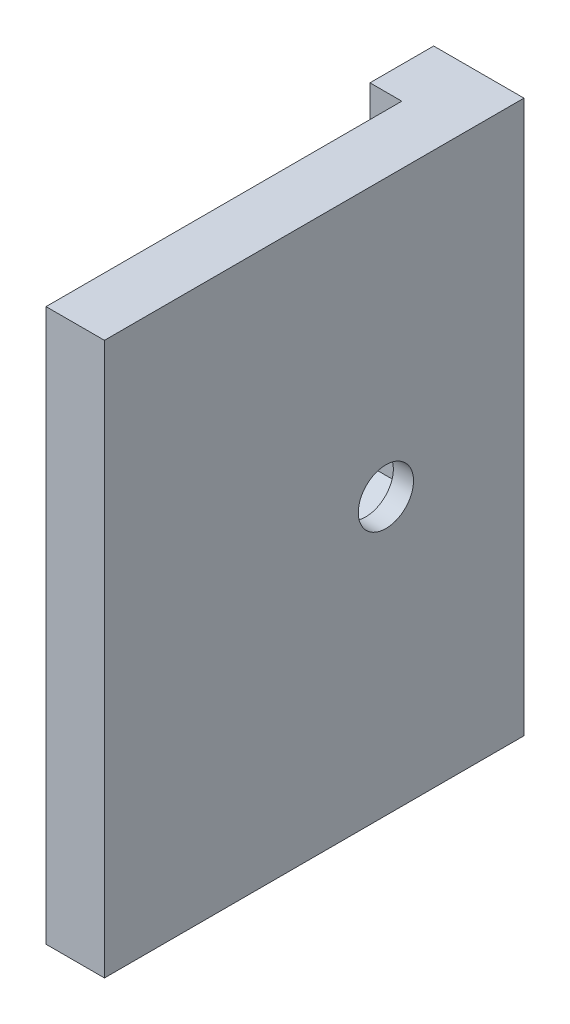
ISO-10303-21;
HEADER;
FILE_DESCRIPTION(('STEP AP214'),'2;1');
FILE_NAME('part.step','',(''),(''),'','','');
FILE_SCHEMA(('AUTOMOTIVE_DESIGN { 1 0 10303 214 1 1 1 1 }'));
ENDSEC;
DATA;
#1=APPLICATION_CONTEXT('core data for automotive mechanical design processes');
#2=APPLICATION_PROTOCOL_DEFINITION('international standard','automotive_design',2000,#1);
#3=PRODUCT_CONTEXT('',#1,'mechanical');
#4=PRODUCT('Part','Part','',(#3));
#5=PRODUCT_RELATED_PRODUCT_CATEGORY('part','',(#4));
#6=PRODUCT_DEFINITION_FORMATION('','',#4);
#7=PRODUCT_DEFINITION_CONTEXT('part definition',#1,'design');
#8=PRODUCT_DEFINITION('design','',#6,#7);
#9=PRODUCT_DEFINITION_SHAPE('','',#8);
#10=(LENGTH_UNIT() NAMED_UNIT(*) SI_UNIT(.MILLI.,.METRE.));
#11=(NAMED_UNIT(*) PLANE_ANGLE_UNIT() SI_UNIT($,.RADIAN.));
#12=(NAMED_UNIT(*) SI_UNIT($,.STERADIAN.) SOLID_ANGLE_UNIT());
#13=UNCERTAINTY_MEASURE_WITH_UNIT(LENGTH_MEASURE(1.E-05),#10,'distance_accuracy_value','');
#14=(GEOMETRIC_REPRESENTATION_CONTEXT(3) GLOBAL_UNCERTAINTY_ASSIGNED_CONTEXT((#13)) GLOBAL_UNIT_ASSIGNED_CONTEXT((#10,
#11,#12)) REPRESENTATION_CONTEXT('',''));
#15=CARTESIAN_POINT('',(0.,0.,0.));
#16=DIRECTION('',(0.,0.,1.));
#17=DIRECTION('',(1.,0.,0.));
#18=AXIS2_PLACEMENT_3D('',#15,#16,#17);
#19=CARTESIAN_POINT('',(327.5,326.,293.));
#20=DIRECTION('',(1.,0.,0.));
#21=DIRECTION('',(0.,0.,-1.));
#22=AXIS2_PLACEMENT_3D('',#19,#20,#21);
#23=PLANE('',#22);
#24=DIRECTION('',(0.,0.,-1.));
#25=VECTOR('',#24,1.);
#26=CARTESIAN_POINT('',(327.5,312.281684622665,293.));
#27=LINE('',#26,#25);
#28=CARTESIAN_POINT('',(327.5,312.281684622665,287.));
#29=VERTEX_POINT('',#28);
#30=CARTESIAN_POINT('',(327.5,312.281684622665,293.));
#31=VERTEX_POINT('',#30);
#32=EDGE_CURVE('E333',#29,#31,#27,.F.);
#33=ORIENTED_EDGE('',*,*,#32,.F.);
#34=DIRECTION('',(0.,-1.,0.));
#35=VECTOR('',#34,1.);
#36=CARTESIAN_POINT('',(327.5,326.,287.));
#37=LINE('',#36,#35);
#38=CARTESIAN_POINT('',(327.5,287.718315377335,287.));
#39=VERTEX_POINT('',#38);
#40=EDGE_CURVE('E306',#29,#39,#37,.T.);
#41=ORIENTED_EDGE('',*,*,#40,.T.);
#42=DIRECTION('',(0.,0.,-1.));
#43=VECTOR('',#42,1.);
#44=CARTESIAN_POINT('',(327.5,287.718315377335,293.));
#45=LINE('',#44,#43);
#46=CARTESIAN_POINT('',(327.5,287.718315377335,293.));
#47=VERTEX_POINT('',#46);
#48=EDGE_CURVE('E316',#47,#39,#45,.T.);
#49=ORIENTED_EDGE('',*,*,#48,.F.);
#50=DIRECTION('',(0.,-1.,0.));
#51=VECTOR('',#50,1.);
#52=CARTESIAN_POINT('',(327.5,326.,293.));
#53=LINE('',#52,#51);
#54=EDGE_CURVE('E309',#31,#47,#53,.T.);
#55=ORIENTED_EDGE('',*,*,#54,.F.);
#56=EDGE_LOOP('',(#33,#41,#49,#55));
#57=FACE_BOUND('',#56,.T.);
#58=ADVANCED_FACE('F39',(#57),#23,.F.);
#59=DIRECTION('',(0.,0.,-1.));
#60=VECTOR('',#59,1.);
#61=CARTESIAN_POINT('',(327.5,321.718315377335,293.));
#62=LINE('',#61,#60);
#63=CARTESIAN_POINT('',(327.5,321.718315377335,293.));
#64=VERTEX_POINT('',#63);
#65=CARTESIAN_POINT('',(327.5,321.718315377335,287.));
#66=VERTEX_POINT('',#65);
#67=EDGE_CURVE('E337',#64,#66,#62,.T.);
#68=ORIENTED_EDGE('',*,*,#67,.F.);
#69=CARTESIAN_POINT('',(327.5,326.,293.));
#70=VERTEX_POINT('',#69);
#71=EDGE_CURVE('E299',#70,#64,#53,.T.);
#72=ORIENTED_EDGE('',*,*,#71,.F.);
#73=DIRECTION('',(0.,0.,-1.));
#74=VECTOR('',#73,1.);
#75=CARTESIAN_POINT('',(327.5,326.,293.));
#76=LINE('',#75,#74);
#77=CARTESIAN_POINT('',(327.5,326.,287.));
#78=VERTEX_POINT('',#77);
#79=EDGE_CURVE('E290',#70,#78,#76,.T.);
#80=ORIENTED_EDGE('',*,*,#79,.T.);
#81=EDGE_CURVE('E296',#78,#66,#37,.T.);
#82=ORIENTED_EDGE('',*,*,#81,.T.);
#83=EDGE_LOOP('',(#68,#72,#80,#82));
#84=FACE_BOUND('',#83,.T.);
#85=ADVANCED_FACE('F295',(#84),#23,.F.);
#86=DIRECTION('',(0.,0.,-1.));
#87=VECTOR('',#86,1.);
#88=CARTESIAN_POINT('',(327.5,278.281684622665,293.));
#89=LINE('',#88,#87);
#90=CARTESIAN_POINT('',(327.5,278.281684622665,287.));
#91=VERTEX_POINT('',#90);
#92=CARTESIAN_POINT('',(327.5,278.281684622665,293.));
#93=VERTEX_POINT('',#92);
#94=EDGE_CURVE('E312',#91,#93,#89,.F.);
#95=ORIENTED_EDGE('',*,*,#94,.F.);
#96=CARTESIAN_POINT('',(327.5,274.,287.));
#97=VERTEX_POINT('',#96);
#98=EDGE_CURVE('E308',#91,#97,#37,.T.);
#99=ORIENTED_EDGE('',*,*,#98,.T.);
#100=DIRECTION('',(0.,0.,-1.));
#101=VECTOR('',#100,1.);
#102=CARTESIAN_POINT('',(327.5,274.,293.));
#103=LINE('',#102,#101);
#104=CARTESIAN_POINT('',(327.5,274.,293.));
#105=VERTEX_POINT('',#104);
#106=EDGE_CURVE('E193',#105,#97,#103,.T.);
#107=ORIENTED_EDGE('',*,*,#106,.F.);
#108=EDGE_CURVE('E305',#93,#105,#53,.T.);
#109=ORIENTED_EDGE('',*,*,#108,.F.);
#110=EDGE_LOOP('',(#95,#99,#107,#109));
#111=FACE_BOUND('',#110,.T.);
#112=ADVANCED_FACE('F329',(#111),#23,.F.);
#113=CARTESIAN_POINT('',(330.5,0.,0.));
#114=DIRECTION('',(-1.,0.,0.));
#115=DIRECTION('',(0.,0.,1.));
#116=AXIS2_PLACEMENT_3D('',#113,#114,#115);
#117=PLANE('',#116);
#118=DIRECTION('',(0.,1.,0.));
#119=VECTOR('',#118,1.);
#120=CARTESIAN_POINT('',(330.5,0.,293.));
#121=LINE('',#120,#119);
#122=CARTESIAN_POINT('',(330.5,274.,293.));
#123=VERTEX_POINT('',#122);
#124=CARTESIAN_POINT('',(330.5,281.795840542121,293.));
#125=VERTEX_POINT('',#124);
#126=EDGE_CURVE('E189',#123,#125,#121,.T.);
#127=ORIENTED_EDGE('',*,*,#126,.F.);
#128=DIRECTION('',(0.,0.,-1.));
#129=VECTOR('',#128,1.);
#130=CARTESIAN_POINT('',(330.5,274.,287.));
#131=LINE('',#130,#129);
#132=CARTESIAN_POINT('',(330.5,274.,326.5));
#133=VERTEX_POINT('',#132);
#134=EDGE_CURVE('E247',#133,#123,#131,.T.);
#135=ORIENTED_EDGE('',*,*,#134,.F.);
#136=DIRECTION('',(0.,-1.,0.));
#137=VECTOR('',#136,1.);
#138=CARTESIAN_POINT('',(330.5,274.,326.5));
#139=LINE('',#138,#137);
#140=CARTESIAN_POINT('',(330.5,326.,326.5));
#141=VERTEX_POINT('',#140);
#142=EDGE_CURVE('E255',#141,#133,#139,.T.);
#143=ORIENTED_EDGE('',*,*,#142,.F.);
#144=DIRECTION('',(0.,0.,1.));
#145=VECTOR('',#144,1.);
#146=CARTESIAN_POINT('',(330.5,326.,326.5));
#147=LINE('',#146,#145);
#148=CARTESIAN_POINT('',(330.5,326.,293.));
#149=VERTEX_POINT('',#148);
#150=EDGE_CURVE('E242',#149,#141,#147,.T.);
#151=ORIENTED_EDGE('',*,*,#150,.F.);
#152=CARTESIAN_POINT('',(330.5,318.204159457879,293.));
#153=VERTEX_POINT('',#152);
#154=EDGE_CURVE('E182',#153,#149,#121,.T.);
#155=ORIENTED_EDGE('',*,*,#154,.F.);
#156=CARTESIAN_POINT('',(330.5,315.795840542121,293.));
#157=VERTEX_POINT('',#156);
#158=EDGE_CURVE('E164',#157,#153,#121,.T.);
#159=ORIENTED_EDGE('',*,*,#158,.F.);
#160=CARTESIAN_POINT('',(330.5,284.204159457879,293.));
#161=VERTEX_POINT('',#160);
#162=EDGE_CURVE('E180',#161,#157,#121,.T.);
#163=ORIENTED_EDGE('',*,*,#162,.F.);
#164=EDGE_CURVE('E188',#125,#161,#121,.T.);
#165=ORIENTED_EDGE('',*,*,#164,.F.);
#166=EDGE_LOOP('',(#127,#135,#143,#151,#155,#159,#163,#165));
#167=FACE_BOUND('',#166,.T.);
#168=DIRECTION('',(0.,-0.499999999999993,0.866025403784443));
#169=VECTOR('',#168,1.);
#170=CARTESIAN_POINT('',(330.5,302.367136103677,304.1));
#171=LINE('',#170,#169);
#172=CARTESIAN_POINT('',(330.5,304.734272207355,300.));
#173=VERTEX_POINT('',#172);
#174=CARTESIAN_POINT('',(330.5,302.367136103678,304.1));
#175=VERTEX_POINT('',#174);
#176=EDGE_CURVE('E199',#173,#175,#171,.T.);
#177=ORIENTED_EDGE('',*,*,#176,.T.);
#178=DIRECTION('',(0.,-1.,0.));
#179=VECTOR('',#178,1.);
#180=CARTESIAN_POINT('',(330.5,297.632863896323,304.1));
#181=LINE('',#180,#179);
#182=CARTESIAN_POINT('',(330.5,297.632863896323,304.1));
#183=VERTEX_POINT('',#182);
#184=EDGE_CURVE('E192',#175,#183,#181,.T.);
#185=ORIENTED_EDGE('',*,*,#184,.T.);
#186=DIRECTION('',(0.,-0.499999999999993,-0.866025403784443));
#187=VECTOR('',#186,1.);
#188=CARTESIAN_POINT('',(330.5,295.265727792645,300.));
#189=LINE('',#188,#187);
#190=CARTESIAN_POINT('',(330.5,295.265727792645,300.));
#191=VERTEX_POINT('',#190);
#192=EDGE_CURVE('E212',#183,#191,#189,.T.);
#193=ORIENTED_EDGE('',*,*,#192,.T.);
#194=DIRECTION('',(0.,0.499999999999998,-0.86602540378444));
#195=VECTOR('',#194,1.);
#196=CARTESIAN_POINT('',(330.5,297.632863896323,295.9));
#197=LINE('',#196,#195);
#198=CARTESIAN_POINT('',(330.5,297.632863896323,295.9));
#199=VERTEX_POINT('',#198);
#200=EDGE_CURVE('E215',#191,#199,#197,.T.);
#201=ORIENTED_EDGE('',*,*,#200,.T.);
#202=DIRECTION('',(0.,1.,0.));
#203=VECTOR('',#202,1.);
#204=CARTESIAN_POINT('',(330.5,302.367136103677,295.9));
#205=LINE('',#204,#203);
#206=CARTESIAN_POINT('',(330.5,302.367136103677,295.9));
#207=VERTEX_POINT('',#206);
#208=EDGE_CURVE('E218',#199,#207,#205,.T.);
#209=ORIENTED_EDGE('',*,*,#208,.T.);
#210=DIRECTION('',(0.,0.499999999999998,0.86602540378444));
#211=VECTOR('',#210,1.);
#212=CARTESIAN_POINT('',(330.5,304.734272207355,300.));
#213=LINE('',#212,#211);
#214=EDGE_CURVE('E221',#207,#173,#213,.T.);
#215=ORIENTED_EDGE('',*,*,#214,.T.);
#216=EDGE_LOOP('',(#177,#185,#193,#201,#209,#215));
#217=FACE_BOUND('',#216,.T.);
#218=ADVANCED_FACE('F177',(#167,#217),#117,.T.);
#219=CARTESIAN_POINT('',(336.,300.,300.));
#220=DIRECTION('',(-1.,0.,0.));
#221=DIRECTION('',(0.,0.,1.));
#222=AXIS2_PLACEMENT_3D('',#219,#220,#221);
#223=CYLINDRICAL_SURFACE('',#222,2.59999999999999);
#224=CARTESIAN_POINT('',(336.,300.,300.));
#225=DIRECTION('',(1.,0.,0.));
#226=DIRECTION('',(0.,0.,-1.));
#227=AXIS2_PLACEMENT_3D('',#224,#225,#226);
#228=CIRCLE('',#227,2.59999999999999);
#229=CARTESIAN_POINT('',(336.,300.,297.4));
#230=VERTEX_POINT('',#229);
#231=EDGE_CURVE('E239',#230,#230,#228,.T.);
#232=ORIENTED_EDGE('',*,*,#231,.T.);
#233=EDGE_LOOP('',(#232));
#234=FACE_BOUND('',#233,.T.);
#235=CARTESIAN_POINT('',(334.1,300.,300.));
#236=DIRECTION('',(-1.,0.,0.));
#237=DIRECTION('',(0.,0.,1.));
#238=AXIS2_PLACEMENT_3D('',#235,#236,#237);
#239=CIRCLE('',#238,2.59999999999999);
#240=CARTESIAN_POINT('',(334.1,300.,302.6));
#241=VERTEX_POINT('',#240);
#242=EDGE_CURVE('E43',#241,#241,#239,.T.);
#243=ORIENTED_EDGE('',*,*,#242,.T.);
#244=EDGE_LOOP('',(#243));
#245=FACE_BOUND('',#244,.T.);
#246=ADVANCED_FACE('F371',(#234,#245),#223,.F.);
#247=CARTESIAN_POINT('',(336.,0.,0.));
#248=DIRECTION('',(-1.,0.,0.));
#249=DIRECTION('',(0.,0.,1.));
#250=AXIS2_PLACEMENT_3D('',#247,#248,#249);
#251=PLANE('',#250);
#252=DIRECTION('',(0.,0.,-1.));
#253=VECTOR('',#252,1.);
#254=CARTESIAN_POINT('',(336.,274.,287.));
#255=LINE('',#254,#253);
#256=CARTESIAN_POINT('',(336.,274.,326.5));
#257=VERTEX_POINT('',#256);
#258=CARTESIAN_POINT('',(336.,274.,287.));
#259=VERTEX_POINT('',#258);
#260=EDGE_CURVE('E251',#257,#259,#255,.T.);
#261=ORIENTED_EDGE('',*,*,#260,.T.);
#262=DIRECTION('',(0.,1.,0.));
#263=VECTOR('',#262,1.);
#264=CARTESIAN_POINT('',(336.,326.,287.));
#265=LINE('',#264,#263);
#266=CARTESIAN_POINT('',(336.,326.,287.));
#267=VERTEX_POINT('',#266);
#268=EDGE_CURVE('E243',#259,#267,#265,.T.);
#269=ORIENTED_EDGE('',*,*,#268,.T.);
#270=DIRECTION('',(0.,0.,1.));
#271=VECTOR('',#270,1.);
#272=CARTESIAN_POINT('',(336.,326.,326.5));
#273=LINE('',#272,#271);
#274=CARTESIAN_POINT('',(336.,326.,326.5));
#275=VERTEX_POINT('',#274);
#276=EDGE_CURVE('E246',#267,#275,#273,.T.);
#277=ORIENTED_EDGE('',*,*,#276,.T.);
#278=DIRECTION('',(0.,-1.,0.));
#279=VECTOR('',#278,1.);
#280=CARTESIAN_POINT('',(336.,274.,326.5));
#281=LINE('',#280,#279);
#282=EDGE_CURVE('E249',#275,#257,#281,.T.);
#283=ORIENTED_EDGE('',*,*,#282,.T.);
#284=EDGE_LOOP('',(#261,#269,#277,#283));
#285=FACE_BOUND('',#284,.T.);
#286=ORIENTED_EDGE('',*,*,#231,.F.);
#287=EDGE_LOOP('',(#286));
#288=FACE_BOUND('',#287,.T.);
#289=ADVANCED_FACE('F283',(#285,#288),#251,.F.);
#290=CARTESIAN_POINT('',(336.,326.,287.));
#291=DIRECTION('',(0.,0.,1.));
#292=DIRECTION('',(1.,0.,0.));
#293=AXIS2_PLACEMENT_3D('',#290,#291,#292);
#294=PLANE('',#293);
#295=CARTESIAN_POINT('',(329.3,283.,287.));
#296=DIRECTION('',(0.,0.,1.));
#297=DIRECTION('',(1.,0.,0.));
#298=AXIS2_PLACEMENT_3D('',#295,#296,#297);
#299=CIRCLE('',#298,1.69999999999998);
#300=CARTESIAN_POINT('',(331.,283.,287.));
#301=VERTEX_POINT('',#300);
#302=EDGE_CURVE('E344',#301,#301,#299,.T.);
#303=ORIENTED_EDGE('',*,*,#302,.T.);
#304=EDGE_LOOP('',(#303));
#305=FACE_BOUND('',#304,.T.);
#306=CARTESIAN_POINT('',(329.3,317.,287.));
#307=DIRECTION('',(0.,0.,1.));
#308=DIRECTION('',(1.,0.,0.));
#309=AXIS2_PLACEMENT_3D('',#306,#307,#308);
#310=CIRCLE('',#309,1.69999999999998);
#311=CARTESIAN_POINT('',(331.,317.,287.));
#312=VERTEX_POINT('',#311);
#313=EDGE_CURVE('E173',#312,#312,#310,.T.);
#314=ORIENTED_EDGE('',*,*,#313,.T.);
#315=EDGE_LOOP('',(#314));
#316=FACE_BOUND('',#315,.T.);
#317=ORIENTED_EDGE('',*,*,#40,.F.);
#318=CARTESIAN_POINT('',(329.3,317.,287.));
#319=DIRECTION('',(0.,0.,1.));
#320=DIRECTION('',(1.,0.,0.));
#321=AXIS2_PLACEMENT_3D('',#318,#319,#320);
#322=CIRCLE('',#321,5.05);
#323=EDGE_CURVE('E304',#66,#29,#322,.T.);
#324=ORIENTED_EDGE('',*,*,#323,.F.);
#325=ORIENTED_EDGE('',*,*,#81,.F.);
#326=DIRECTION('',(-1.,0.,0.));
#327=VECTOR('',#326,1.);
#328=CARTESIAN_POINT('',(336.,326.,287.));
#329=LINE('',#328,#327);
#330=EDGE_CURVE('E11',#267,#78,#329,.T.);
#331=ORIENTED_EDGE('',*,*,#330,.F.);
#332=ORIENTED_EDGE('',*,*,#268,.F.);
#333=DIRECTION('',(-1.,0.,0.));
#334=VECTOR('',#333,1.);
#335=CARTESIAN_POINT('',(336.,274.,287.));
#336=LINE('',#335,#334);
#337=EDGE_CURVE('E253',#259,#97,#336,.T.);
#338=ORIENTED_EDGE('',*,*,#337,.T.);
#339=ORIENTED_EDGE('',*,*,#98,.F.);
#340=CARTESIAN_POINT('',(329.3,283.,287.));
#341=DIRECTION('',(0.,0.,1.));
#342=DIRECTION('',(1.,0.,0.));
#343=AXIS2_PLACEMENT_3D('',#340,#341,#342);
#344=CIRCLE('',#343,5.05);
#345=EDGE_CURVE('E331',#39,#91,#344,.T.);
#346=ORIENTED_EDGE('',*,*,#345,.F.);
#347=EDGE_LOOP('',(#317,#324,#325,#331,#332,#338,#339,#346));
#348=FACE_BOUND('',#347,.T.);
#349=ADVANCED_FACE('F41',(#305,#316,#348),#294,.F.);
#350=CARTESIAN_POINT('',(336.,326.,326.5));
#351=DIRECTION('',(0.,-1.,0.));
#352=DIRECTION('',(0.,0.,-1.));
#353=AXIS2_PLACEMENT_3D('',#350,#351,#352);
#354=PLANE('',#353);
#355=DIRECTION('',(-1.,0.,0.));
#356=VECTOR('',#355,1.);
#357=CARTESIAN_POINT('',(336.,326.,326.5));
#358=LINE('',#357,#356);
#359=EDGE_CURVE('E48',#275,#141,#358,.T.);
#360=ORIENTED_EDGE('',*,*,#359,.F.);
#361=ORIENTED_EDGE('',*,*,#276,.F.);
#362=ORIENTED_EDGE('',*,*,#330,.T.);
#363=ORIENTED_EDGE('',*,*,#79,.F.);
#364=DIRECTION('',(-1.,0.,0.));
#365=VECTOR('',#364,1.);
#366=CARTESIAN_POINT('',(336.,326.,293.));
#367=LINE('',#366,#365);
#368=EDGE_CURVE('E300',#149,#70,#367,.T.);
#369=ORIENTED_EDGE('',*,*,#368,.F.);
#370=ORIENTED_EDGE('',*,*,#150,.T.);
#371=EDGE_LOOP('',(#360,#361,#362,#363,#369,#370));
#372=FACE_BOUND('',#371,.T.);
#373=ADVANCED_FACE('F286',(#372),#354,.F.);
#374=CARTESIAN_POINT('',(336.,274.,326.5));
#375=DIRECTION('',(0.,0.,-1.));
#376=DIRECTION('',(-1.,0.,0.));
#377=AXIS2_PLACEMENT_3D('',#374,#375,#376);
#378=PLANE('',#377);
#379=ORIENTED_EDGE('',*,*,#142,.T.);
#380=DIRECTION('',(-1.,0.,0.));
#381=VECTOR('',#380,1.);
#382=CARTESIAN_POINT('',(336.,274.,326.5));
#383=LINE('',#382,#381);
#384=EDGE_CURVE('E261',#257,#133,#383,.T.);
#385=ORIENTED_EDGE('',*,*,#384,.F.);
#386=ORIENTED_EDGE('',*,*,#282,.F.);
#387=ORIENTED_EDGE('',*,*,#359,.T.);
#388=EDGE_LOOP('',(#379,#385,#386,#387));
#389=FACE_BOUND('',#388,.T.);
#390=ADVANCED_FACE('F269',(#389),#378,.F.);
#391=CARTESIAN_POINT('',(336.,274.,287.));
#392=DIRECTION('',(0.,1.,0.));
#393=DIRECTION('',(0.,0.,1.));
#394=AXIS2_PLACEMENT_3D('',#391,#392,#393);
#395=PLANE('',#394);
#396=ORIENTED_EDGE('',*,*,#134,.T.);
#397=DIRECTION('',(1.,0.,0.));
#398=VECTOR('',#397,1.);
#399=CARTESIAN_POINT('',(327.5,274.,293.));
#400=LINE('',#399,#398);
#401=EDGE_CURVE('E277',#105,#123,#400,.T.);
#402=ORIENTED_EDGE('',*,*,#401,.F.);
#403=ORIENTED_EDGE('',*,*,#106,.T.);
#404=ORIENTED_EDGE('',*,*,#337,.F.);
#405=ORIENTED_EDGE('',*,*,#260,.F.);
#406=ORIENTED_EDGE('',*,*,#384,.T.);
#407=EDGE_LOOP('',(#396,#402,#403,#404,#405,#406));
#408=FACE_BOUND('',#407,.T.);
#409=ADVANCED_FACE('F275',(#408),#395,.F.);
#410=CARTESIAN_POINT('',(334.1,297.632863896323,304.1));
#411=DIRECTION('',(0.,0.,-1.));
#412=DIRECTION('',(-1.,0.,0.));
#413=AXIS2_PLACEMENT_3D('',#410,#411,#412);
#414=PLANE('',#413);
#415=ORIENTED_EDGE('',*,*,#184,.F.);
#416=DIRECTION('',(-1.,0.,0.));
#417=VECTOR('',#416,1.);
#418=CARTESIAN_POINT('',(334.1,302.367136103677,304.1));
#419=LINE('',#418,#417);
#420=CARTESIAN_POINT('',(334.1,302.367136103677,304.1));
#421=VERTEX_POINT('',#420);
#422=EDGE_CURVE('E209',#421,#175,#419,.T.);
#423=ORIENTED_EDGE('',*,*,#422,.F.);
#424=DIRECTION('',(0.,-1.,0.));
#425=VECTOR('',#424,1.);
#426=CARTESIAN_POINT('',(334.1,297.632863896323,304.1));
#427=LINE('',#426,#425);
#428=CARTESIAN_POINT('',(334.1,297.632863896323,304.1));
#429=VERTEX_POINT('',#428);
#430=EDGE_CURVE('E195',#421,#429,#427,.T.);
#431=ORIENTED_EDGE('',*,*,#430,.T.);
#432=DIRECTION('',(-1.,0.,0.));
#433=VECTOR('',#432,1.);
#434=CARTESIAN_POINT('',(334.1,297.632863896323,304.1));
#435=LINE('',#434,#433);
#436=EDGE_CURVE('E236',#429,#183,#435,.T.);
#437=ORIENTED_EDGE('',*,*,#436,.T.);
#438=EDGE_LOOP('',(#415,#423,#431,#437));
#439=FACE_BOUND('',#438,.T.);
#440=ADVANCED_FACE('F383',(#439),#414,.T.);
#441=CARTESIAN_POINT('',(334.1,295.265727792645,300.));
#442=DIRECTION('',(0.,0.866025403784443,-0.499999999999993));
#443=DIRECTION('',(0.,0.499999999999993,0.866025403784443));
#444=AXIS2_PLACEMENT_3D('',#441,#442,#443);
#445=PLANE('',#444);
#446=ORIENTED_EDGE('',*,*,#192,.F.);
#447=ORIENTED_EDGE('',*,*,#436,.F.);
#448=DIRECTION('',(0.,-0.499999999999993,-0.866025403784443));
#449=VECTOR('',#448,1.);
#450=CARTESIAN_POINT('',(334.1,295.265727792645,300.));
#451=LINE('',#450,#449);
#452=CARTESIAN_POINT('',(334.1,295.265727792645,300.));
#453=VERTEX_POINT('',#452);
#454=EDGE_CURVE('E198',#429,#453,#451,.T.);
#455=ORIENTED_EDGE('',*,*,#454,.T.);
#456=DIRECTION('',(-1.,0.,0.));
#457=VECTOR('',#456,1.);
#458=CARTESIAN_POINT('',(334.1,295.265727792645,300.));
#459=LINE('',#458,#457);
#460=EDGE_CURVE('E234',#453,#191,#459,.T.);
#461=ORIENTED_EDGE('',*,*,#460,.T.);
#462=EDGE_LOOP('',(#446,#447,#455,#461));
#463=FACE_BOUND('',#462,.T.);
#464=ADVANCED_FACE('F432',(#463),#445,.T.);
#465=CARTESIAN_POINT('',(334.1,297.632863896323,295.9));
#466=DIRECTION('',(0.,0.86602540378444,0.499999999999998));
#467=DIRECTION('',(0.,-0.499999999999998,0.86602540378444));
#468=AXIS2_PLACEMENT_3D('',#465,#466,#467);
#469=PLANE('',#468);
#470=ORIENTED_EDGE('',*,*,#200,.F.);
#471=ORIENTED_EDGE('',*,*,#460,.F.);
#472=DIRECTION('',(0.,0.499999999999998,-0.86602540378444));
#473=VECTOR('',#472,1.);
#474=CARTESIAN_POINT('',(334.1,297.632863896323,295.9));
#475=LINE('',#474,#473);
#476=CARTESIAN_POINT('',(334.1,297.632863896323,295.9));
#477=VERTEX_POINT('',#476);
#478=EDGE_CURVE('E201',#453,#477,#475,.T.);
#479=ORIENTED_EDGE('',*,*,#478,.T.);
#480=DIRECTION('',(-1.,0.,0.));
#481=VECTOR('',#480,1.);
#482=CARTESIAN_POINT('',(334.1,297.632863896323,295.9));
#483=LINE('',#482,#481);
#484=EDGE_CURVE('E232',#477,#199,#483,.T.);
#485=ORIENTED_EDGE('',*,*,#484,.T.);
#486=EDGE_LOOP('',(#470,#471,#479,#485));
#487=FACE_BOUND('',#486,.T.);
#488=ADVANCED_FACE('F428',(#487),#469,.T.);
#489=CARTESIAN_POINT('',(334.1,302.367136103677,295.9));
#490=DIRECTION('',(0.,0.,1.));
#491=DIRECTION('',(1.,0.,0.));
#492=AXIS2_PLACEMENT_3D('',#489,#490,#491);
#493=PLANE('',#492);
#494=ORIENTED_EDGE('',*,*,#208,.F.);
#495=ORIENTED_EDGE('',*,*,#484,.F.);
#496=DIRECTION('',(0.,1.,0.));
#497=VECTOR('',#496,1.);
#498=CARTESIAN_POINT('',(334.1,302.367136103677,295.9));
#499=LINE('',#498,#497);
#500=CARTESIAN_POINT('',(334.1,302.367136103677,295.9));
#501=VERTEX_POINT('',#500);
#502=EDGE_CURVE('E203',#477,#501,#499,.T.);
#503=ORIENTED_EDGE('',*,*,#502,.T.);
#504=DIRECTION('',(-1.,0.,0.));
#505=VECTOR('',#504,1.);
#506=CARTESIAN_POINT('',(334.1,302.367136103677,295.9));
#507=LINE('',#506,#505);
#508=EDGE_CURVE('E230',#501,#207,#507,.T.);
#509=ORIENTED_EDGE('',*,*,#508,.T.);
#510=EDGE_LOOP('',(#494,#495,#503,#509));
#511=FACE_BOUND('',#510,.T.);
#512=ADVANCED_FACE('F424',(#511),#493,.T.);
#513=CARTESIAN_POINT('',(334.1,304.734272207355,300.));
#514=DIRECTION('',(0.,-0.86602540378444,0.499999999999998));
#515=DIRECTION('',(0.,-0.499999999999998,-0.86602540378444));
#516=AXIS2_PLACEMENT_3D('',#513,#514,#515);
#517=PLANE('',#516);
#518=ORIENTED_EDGE('',*,*,#214,.F.);
#519=ORIENTED_EDGE('',*,*,#508,.F.);
#520=DIRECTION('',(0.,0.499999999999998,0.86602540378444));
#521=VECTOR('',#520,1.);
#522=CARTESIAN_POINT('',(334.1,304.734272207355,300.));
#523=LINE('',#522,#521);
#524=CARTESIAN_POINT('',(334.1,304.734272207355,300.));
#525=VERTEX_POINT('',#524);
#526=EDGE_CURVE('E205',#501,#525,#523,.T.);
#527=ORIENTED_EDGE('',*,*,#526,.T.);
#528=DIRECTION('',(-1.,0.,0.));
#529=VECTOR('',#528,1.);
#530=CARTESIAN_POINT('',(334.1,304.734272207355,300.));
#531=LINE('',#530,#529);
#532=EDGE_CURVE('E228',#525,#173,#531,.T.);
#533=ORIENTED_EDGE('',*,*,#532,.T.);
#534=EDGE_LOOP('',(#518,#519,#527,#533));
#535=FACE_BOUND('',#534,.T.);
#536=ADVANCED_FACE('F416',(#535),#517,.T.);
#537=CARTESIAN_POINT('',(334.1,302.367136103677,304.1));
#538=DIRECTION('',(0.,-0.866025403784443,-0.499999999999993));
#539=DIRECTION('',(0.,0.499999999999993,-0.866025403784443));
#540=AXIS2_PLACEMENT_3D('',#537,#538,#539);
#541=PLANE('',#540);
#542=ORIENTED_EDGE('',*,*,#176,.F.);
#543=ORIENTED_EDGE('',*,*,#532,.F.);
#544=DIRECTION('',(0.,-0.499999999999993,0.866025403784443));
#545=VECTOR('',#544,1.);
#546=CARTESIAN_POINT('',(334.1,302.367136103677,304.1));
#547=LINE('',#546,#545);
#548=EDGE_CURVE('E207',#525,#421,#547,.T.);
#549=ORIENTED_EDGE('',*,*,#548,.T.);
#550=ORIENTED_EDGE('',*,*,#422,.T.);
#551=EDGE_LOOP('',(#542,#543,#549,#550));
#552=FACE_BOUND('',#551,.T.);
#553=ADVANCED_FACE('F411',(#552),#541,.T.);
#554=CARTESIAN_POINT('',(334.1,0.,0.));
#555=DIRECTION('',(-1.,0.,0.));
#556=DIRECTION('',(0.,0.,1.));
#557=AXIS2_PLACEMENT_3D('',#554,#555,#556);
#558=PLANE('',#557);
#559=ORIENTED_EDGE('',*,*,#242,.F.);
#560=EDGE_LOOP('',(#559));
#561=FACE_BOUND('',#560,.T.);
#562=ORIENTED_EDGE('',*,*,#430,.F.);
#563=ORIENTED_EDGE('',*,*,#548,.F.);
#564=ORIENTED_EDGE('',*,*,#526,.F.);
#565=ORIENTED_EDGE('',*,*,#502,.F.);
#566=ORIENTED_EDGE('',*,*,#478,.F.);
#567=ORIENTED_EDGE('',*,*,#454,.F.);
#568=EDGE_LOOP('',(#562,#563,#564,#565,#566,#567));
#569=FACE_BOUND('',#568,.T.);
#570=ADVANCED_FACE('F407',(#561,#569),#558,.T.);
#571=CARTESIAN_POINT('',(0.,0.,293.));
#572=DIRECTION('',(0.,0.,1.));
#573=DIRECTION('',(1.,0.,0.));
#574=AXIS2_PLACEMENT_3D('',#571,#572,#573);
#575=PLANE('',#574);
#576=ORIENTED_EDGE('',*,*,#126,.T.);
#577=CARTESIAN_POINT('',(329.3,283.,293.));
#578=DIRECTION('',(0.,0.,1.));
#579=DIRECTION('',(1.,0.,0.));
#580=AXIS2_PLACEMENT_3D('',#577,#578,#579);
#581=CIRCLE('',#580,1.69999999999998);
#582=EDGE_CURVE('E187',#161,#125,#581,.T.);
#583=ORIENTED_EDGE('',*,*,#582,.F.);
#584=ORIENTED_EDGE('',*,*,#162,.T.);
#585=CARTESIAN_POINT('',(329.3,317.,293.));
#586=DIRECTION('',(0.,0.,1.));
#587=DIRECTION('',(1.,0.,0.));
#588=AXIS2_PLACEMENT_3D('',#585,#586,#587);
#589=CIRCLE('',#588,1.69999999999998);
#590=EDGE_CURVE('E166',#153,#157,#589,.T.);
#591=ORIENTED_EDGE('',*,*,#590,.F.);
#592=ORIENTED_EDGE('',*,*,#154,.T.);
#593=ORIENTED_EDGE('',*,*,#368,.T.);
#594=ORIENTED_EDGE('',*,*,#71,.T.);
#595=CARTESIAN_POINT('',(329.3,317.,293.));
#596=DIRECTION('',(0.,0.,1.));
#597=DIRECTION('',(1.,0.,0.));
#598=AXIS2_PLACEMENT_3D('',#595,#596,#597);
#599=CIRCLE('',#598,5.05);
#600=EDGE_CURVE('E339',#64,#31,#599,.T.);
#601=ORIENTED_EDGE('',*,*,#600,.T.);
#602=ORIENTED_EDGE('',*,*,#54,.T.);
#603=CARTESIAN_POINT('',(329.3,283.,293.));
#604=DIRECTION('',(0.,0.,1.));
#605=DIRECTION('',(1.,0.,0.));
#606=AXIS2_PLACEMENT_3D('',#603,#604,#605);
#607=CIRCLE('',#606,5.05);
#608=EDGE_CURVE('E323',#47,#93,#607,.T.);
#609=ORIENTED_EDGE('',*,*,#608,.T.);
#610=ORIENTED_EDGE('',*,*,#108,.T.);
#611=ORIENTED_EDGE('',*,*,#401,.T.);
#612=EDGE_LOOP('',(#576,#583,#584,#591,#592,#593,#594,#601,#602,#609,#610,#611));
#613=FACE_BOUND('',#612,.T.);
#614=ADVANCED_FACE('F186',(#613),#575,.T.);
#615=CARTESIAN_POINT('',(329.3,283.,293.));
#616=DIRECTION('',(0.,0.,-1.));
#617=DIRECTION('',(-1.,0.,0.));
#618=AXIS2_PLACEMENT_3D('',#615,#616,#617);
#619=CYLINDRICAL_SURFACE('',#618,5.05);
#620=ORIENTED_EDGE('',*,*,#345,.T.);
#621=ORIENTED_EDGE('',*,*,#94,.T.);
#622=ORIENTED_EDGE('',*,*,#608,.F.);
#623=ORIENTED_EDGE('',*,*,#48,.T.);
#624=EDGE_LOOP('',(#620,#621,#622,#623));
#625=FACE_BOUND('',#624,.T.);
#626=ADVANCED_FACE('F403',(#625),#619,.T.);
#627=CARTESIAN_POINT('',(329.3,317.,293.));
#628=DIRECTION('',(0.,0.,-1.));
#629=DIRECTION('',(-1.,0.,0.));
#630=AXIS2_PLACEMENT_3D('',#627,#628,#629);
#631=CYLINDRICAL_SURFACE('',#630,5.05);
#632=ORIENTED_EDGE('',*,*,#323,.T.);
#633=ORIENTED_EDGE('',*,*,#32,.T.);
#634=ORIENTED_EDGE('',*,*,#600,.F.);
#635=ORIENTED_EDGE('',*,*,#67,.T.);
#636=EDGE_LOOP('',(#632,#633,#634,#635));
#637=FACE_BOUND('',#636,.T.);
#638=ADVANCED_FACE('F397',(#637),#631,.T.);
#639=CARTESIAN_POINT('',(329.3,317.,293.));
#640=DIRECTION('',(0.,0.,-1.));
#641=DIRECTION('',(-1.,0.,0.));
#642=AXIS2_PLACEMENT_3D('',#639,#640,#641);
#643=CYLINDRICAL_SURFACE('',#642,1.69999999999998);
#644=ORIENTED_EDGE('',*,*,#590,.T.);
#645=EDGE_CURVE('E54',#157,#153,#589,.T.);
#646=ORIENTED_EDGE('',*,*,#645,.T.);
#647=EDGE_LOOP('',(#644,#646));
#648=FACE_BOUND('',#647,.T.);
#649=ORIENTED_EDGE('',*,*,#313,.F.);
#650=EDGE_LOOP('',(#649));
#651=FACE_BOUND('',#650,.T.);
#652=ADVANCED_FACE('F168',(#648,#651),#643,.F.);
#653=CARTESIAN_POINT('',(329.3,317.,293.));
#654=DIRECTION('',(0.,0.,1.));
#655=DIRECTION('',(1.,0.,0.));
#656=AXIS2_PLACEMENT_3D('',#653,#654,#655);
#657=PLANE('',#656);
#658=ORIENTED_EDGE('',*,*,#158,.T.);
#659=ORIENTED_EDGE('',*,*,#645,.F.);
#660=EDGE_LOOP('',(#658,#659));
#661=FACE_BOUND('',#660,.T.);
#662=ADVANCED_FACE('F162',(#661),#657,.F.);
#663=CARTESIAN_POINT('',(329.3,283.,293.));
#664=DIRECTION('',(0.,0.,-1.));
#665=DIRECTION('',(-1.,0.,0.));
#666=AXIS2_PLACEMENT_3D('',#663,#664,#665);
#667=CYLINDRICAL_SURFACE('',#666,1.69999999999998);
#668=ORIENTED_EDGE('',*,*,#582,.T.);
#669=EDGE_CURVE('E61',#125,#161,#581,.T.);
#670=ORIENTED_EDGE('',*,*,#669,.T.);
#671=EDGE_LOOP('',(#668,#670));
#672=FACE_BOUND('',#671,.T.);
#673=ORIENTED_EDGE('',*,*,#302,.F.);
#674=EDGE_LOOP('',(#673));
#675=FACE_BOUND('',#674,.T.);
#676=ADVANCED_FACE('F347',(#672,#675),#667,.F.);
#677=CARTESIAN_POINT('',(329.3,283.,293.));
#678=DIRECTION('',(0.,0.,1.));
#679=DIRECTION('',(1.,0.,0.));
#680=AXIS2_PLACEMENT_3D('',#677,#678,#679);
#681=PLANE('',#680);
#682=ORIENTED_EDGE('',*,*,#164,.T.);
#683=ORIENTED_EDGE('',*,*,#669,.F.);
#684=EDGE_LOOP('',(#682,#683));
#685=FACE_BOUND('',#684,.T.);
#686=ADVANCED_FACE('F350',(#685),#681,.F.);
#687=CLOSED_SHELL('',(#58,#85,#112,#218,#246,#289,#349,#373,#390,#409,#440,#464,#488,#512,#536,
#553,#570,#614,#626,#638,#652,#662,#676,#686));
#688=MANIFOLD_SOLID_BREP('B2',#687);
#689=ADVANCED_BREP_SHAPE_REPRESENTATION('',(#18,#688),#14);
#690=SHAPE_DEFINITION_REPRESENTATION(#9,#689);
ENDSEC;
END-ISO-10303-21;
